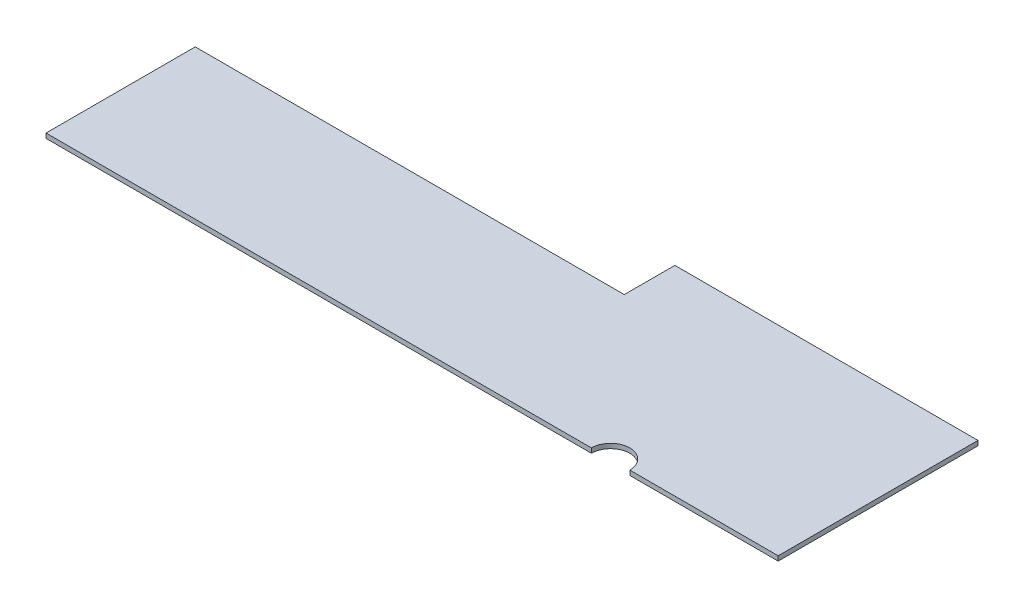
ISO-10303-21;
HEADER;
FILE_DESCRIPTION(('STEP AP214'),'2;1');
FILE_NAME('part.step','',(''),(''),'','','');
FILE_SCHEMA(('AUTOMOTIVE_DESIGN { 1 0 10303 214 1 1 1 1 }'));
ENDSEC;
DATA;
#1=APPLICATION_CONTEXT('core data for automotive mechanical design processes');
#2=APPLICATION_PROTOCOL_DEFINITION('international standard','automotive_design',2000,#1);
#3=PRODUCT_CONTEXT('',#1,'mechanical');
#4=PRODUCT('Part','Part','',(#3));
#5=PRODUCT_RELATED_PRODUCT_CATEGORY('part','',(#4));
#6=PRODUCT_DEFINITION_FORMATION('','',#4);
#7=PRODUCT_DEFINITION_CONTEXT('part definition',#1,'design');
#8=PRODUCT_DEFINITION('design','',#6,#7);
#9=PRODUCT_DEFINITION_SHAPE('','',#8);
#10=(LENGTH_UNIT() NAMED_UNIT(*) SI_UNIT(.MILLI.,.METRE.));
#11=(NAMED_UNIT(*) PLANE_ANGLE_UNIT() SI_UNIT($,.RADIAN.));
#12=(NAMED_UNIT(*) SI_UNIT($,.STERADIAN.) SOLID_ANGLE_UNIT());
#13=UNCERTAINTY_MEASURE_WITH_UNIT(LENGTH_MEASURE(1.E-05),#10,'distance_accuracy_value','');
#14=(GEOMETRIC_REPRESENTATION_CONTEXT(3) GLOBAL_UNCERTAINTY_ASSIGNED_CONTEXT((#13)) GLOBAL_UNIT_ASSIGNED_CONTEXT((#10,
#11,#12)) REPRESENTATION_CONTEXT('',''));
#15=CARTESIAN_POINT('',(0.,0.,0.));
#16=DIRECTION('',(0.,0.,1.));
#17=DIRECTION('',(1.,0.,0.));
#18=AXIS2_PLACEMENT_3D('',#15,#16,#17);
#19=CARTESIAN_POINT('',(906.3228,1.58749999999684,520.7));
#20=DIRECTION('',(0.,-1.,0.));
#21=DIRECTION('',(1.,0.,0.));
#22=AXIS2_PLACEMENT_3D('',#19,#20,#21);
#23=CYLINDRICAL_SURFACE('',#22,13.081);
#24=CARTESIAN_POINT('',(906.3228,-1.58750000000316,520.7));
#25=DIRECTION('',(0.,1.,0.));
#26=DIRECTION('',(-1.,0.,0.));
#27=AXIS2_PLACEMENT_3D('',#24,#25,#26);
#28=CIRCLE('',#27,13.081);
#29=CARTESIAN_POINT('',(919.4038,-1.58750000000321,520.699999999993));
#30=VERTEX_POINT('',#29);
#31=CARTESIAN_POINT('',(893.2418,-1.58750000000312,520.699999999993));
#32=VERTEX_POINT('',#31);
#33=EDGE_CURVE('E127',#30,#32,#28,.T.);
#34=ORIENTED_EDGE('',*,*,#33,.F.);
#35=DIRECTION('',(0.,-1.,0.));
#36=VECTOR('',#35,1.);
#37=CARTESIAN_POINT('',(919.4038,1.58749999999679,520.699999999993));
#38=LINE('',#37,#36);
#39=CARTESIAN_POINT('',(919.4038,1.58749999999679,520.699999999993));
#40=VERTEX_POINT('',#39);
#41=EDGE_CURVE('E11',#40,#30,#38,.T.);
#42=ORIENTED_EDGE('',*,*,#41,.F.);
#43=CARTESIAN_POINT('',(906.3228,1.58749999999684,520.7));
#44=DIRECTION('',(0.,1.,0.));
#45=DIRECTION('',(-1.,0.,0.));
#46=AXIS2_PLACEMENT_3D('',#43,#44,#45);
#47=CIRCLE('',#46,13.081);
#48=CARTESIAN_POINT('',(893.2418,1.58749999999688,520.699999999993));
#49=VERTEX_POINT('',#48);
#50=EDGE_CURVE('E144',#40,#49,#47,.T.);
#51=ORIENTED_EDGE('',*,*,#50,.T.);
#52=DIRECTION('',(0.,-1.,0.));
#53=VECTOR('',#52,1.);
#54=CARTESIAN_POINT('',(893.2418,1.58749999999688,520.699999999993));
#55=LINE('',#54,#53);
#56=EDGE_CURVE('E86',#49,#32,#55,.T.);
#57=ORIENTED_EDGE('',*,*,#56,.T.);
#58=EDGE_LOOP('',(#34,#42,#51,#57));
#59=FACE_BOUND('',#58,.T.);
#60=ADVANCED_FACE('F35',(#59),#23,.F.);
#61=CARTESIAN_POINT('',(0.,1.5875,520.699999999993));
#62=DIRECTION('',(0.,0.,1.));
#63=DIRECTION('',(0.,-1.,0.));
#64=AXIS2_PLACEMENT_3D('',#61,#62,#63);
#65=PLANE('',#64);
#66=DIRECTION('',(-1.,0.,0.));
#67=VECTOR('',#66,1.);
#68=CARTESIAN_POINT('',(0.,-1.5875,520.699999999993));
#69=LINE('',#68,#67);
#70=CARTESIAN_POINT('',(1020.41959999994,-1.58750000000356,520.699999999993));
#71=VERTEX_POINT('',#70);
#72=EDGE_CURVE('E130',#71,#30,#69,.T.);
#73=ORIENTED_EDGE('',*,*,#72,.F.);
#74=DIRECTION('',(0.,-1.,0.));
#75=VECTOR('',#74,1.);
#76=CARTESIAN_POINT('',(1020.41959999994,1.58749999999644,520.699999999993));
#77=LINE('',#76,#75);
#78=CARTESIAN_POINT('',(1020.41959999994,1.58749999999644,520.699999999993));
#79=VERTEX_POINT('',#78);
#80=EDGE_CURVE('E43',#79,#71,#77,.T.);
#81=ORIENTED_EDGE('',*,*,#80,.F.);
#82=DIRECTION('',(-1.,0.,0.));
#83=VECTOR('',#82,1.);
#84=CARTESIAN_POINT('',(0.,1.5875,520.699999999993));
#85=LINE('',#84,#83);
#86=EDGE_CURVE('E177',#79,#40,#85,.T.);
#87=ORIENTED_EDGE('',*,*,#86,.T.);
#88=ORIENTED_EDGE('',*,*,#41,.T.);
#89=EDGE_LOOP('',(#73,#81,#87,#88));
#90=FACE_BOUND('',#89,.T.);
#91=ADVANCED_FACE('F162',(#90),#65,.T.);
#92=CARTESIAN_POINT('',(1020.41959999994,1.58749999999644,0.));
#93=DIRECTION('',(1.,0.,0.));
#94=DIRECTION('',(0.,1.,0.));
#95=AXIS2_PLACEMENT_3D('',#92,#93,#94);
#96=PLANE('',#95);
#97=DIRECTION('',(0.,0.,1.));
#98=VECTOR('',#97,1.);
#99=CARTESIAN_POINT('',(1020.41959999994,-1.58750000000356,0.));
#100=LINE('',#99,#98);
#101=CARTESIAN_POINT('',(1020.41959999994,-1.58750000000356,384.668661408231));
#102=VERTEX_POINT('',#101);
#103=EDGE_CURVE('E133',#102,#71,#100,.T.);
#104=ORIENTED_EDGE('',*,*,#103,.F.);
#105=DIRECTION('',(0.,-1.,0.));
#106=VECTOR('',#105,1.);
#107=CARTESIAN_POINT('',(1020.41959999994,1.58749999999644,384.668661408231));
#108=LINE('',#107,#106);
#109=CARTESIAN_POINT('',(1020.41959999994,1.58749999999644,384.668661408231));
#110=VERTEX_POINT('',#109);
#111=EDGE_CURVE('E151',#110,#102,#108,.T.);
#112=ORIENTED_EDGE('',*,*,#111,.F.);
#113=DIRECTION('',(0.,0.,1.));
#114=VECTOR('',#113,1.);
#115=CARTESIAN_POINT('',(1020.41959999994,1.58749999999644,0.));
#116=LINE('',#115,#114);
#117=EDGE_CURVE('E158',#110,#79,#116,.T.);
#118=ORIENTED_EDGE('',*,*,#117,.T.);
#119=ORIENTED_EDGE('',*,*,#80,.T.);
#120=EDGE_LOOP('',(#104,#112,#118,#119));
#121=FACE_BOUND('',#120,.T.);
#122=ADVANCED_FACE('F156',(#121),#96,.T.);
#123=CARTESIAN_POINT('',(0.,1.5875,384.668661408231));
#124=DIRECTION('',(0.,0.,1.));
#125=DIRECTION('',(0.,-1.,0.));
#126=AXIS2_PLACEMENT_3D('',#123,#124,#125);
#127=PLANE('',#126);
#128=DIRECTION('',(-1.,0.,0.));
#129=VECTOR('',#128,1.);
#130=CARTESIAN_POINT('',(0.,-1.5875,384.668661408231));
#131=LINE('',#130,#129);
#132=CARTESIAN_POINT('',(814.044599999936,-1.58750000000284,384.668661408231));
#133=VERTEX_POINT('',#132);
#134=EDGE_CURVE('E136',#102,#133,#131,.T.);
#135=ORIENTED_EDGE('',*,*,#134,.T.);
#136=DIRECTION('',(0.,-1.,0.));
#137=VECTOR('',#136,1.);
#138=CARTESIAN_POINT('',(814.044599999936,1.58749999999716,384.668661408231));
#139=LINE('',#138,#137);
#140=CARTESIAN_POINT('',(814.044599999936,1.58749999999716,384.668661408231));
#141=VERTEX_POINT('',#140);
#142=EDGE_CURVE('E148',#141,#133,#139,.T.);
#143=ORIENTED_EDGE('',*,*,#142,.F.);
#144=DIRECTION('',(-1.,0.,0.));
#145=VECTOR('',#144,1.);
#146=CARTESIAN_POINT('',(0.,1.5875,384.668661408231));
#147=LINE('',#146,#145);
#148=EDGE_CURVE('E173',#110,#141,#147,.T.);
#149=ORIENTED_EDGE('',*,*,#148,.F.);
#150=ORIENTED_EDGE('',*,*,#111,.T.);
#151=EDGE_LOOP('',(#135,#143,#149,#150));
#152=FACE_BOUND('',#151,.T.);
#153=ADVANCED_FACE('F169',(#152),#127,.F.);
#154=CARTESIAN_POINT('',(814.044599999936,1.58749999999716,0.));
#155=DIRECTION('',(1.,0.,0.));
#156=DIRECTION('',(0.,1.,0.));
#157=AXIS2_PLACEMENT_3D('',#154,#155,#156);
#158=PLANE('',#157);
#159=DIRECTION('',(0.,0.,1.));
#160=VECTOR('',#159,1.);
#161=CARTESIAN_POINT('',(814.044599999936,-1.58750000000284,0.));
#162=LINE('',#161,#160);
#163=CARTESIAN_POINT('',(814.044599999936,-1.58750000000284,419.099999999993));
#164=VERTEX_POINT('',#163);
#165=EDGE_CURVE('E138',#133,#164,#162,.T.);
#166=ORIENTED_EDGE('',*,*,#165,.T.);
#167=DIRECTION('',(0.,-1.,0.));
#168=VECTOR('',#167,1.);
#169=CARTESIAN_POINT('',(814.044599999936,1.58749999999716,419.099999999993));
#170=LINE('',#169,#168);
#171=CARTESIAN_POINT('',(814.044599999936,1.58749999999716,419.099999999993));
#172=VERTEX_POINT('',#171);
#173=EDGE_CURVE('E119',#172,#164,#170,.T.);
#174=ORIENTED_EDGE('',*,*,#173,.F.);
#175=DIRECTION('',(0.,0.,1.));
#176=VECTOR('',#175,1.);
#177=CARTESIAN_POINT('',(814.044599999936,1.58749999999716,0.));
#178=LINE('',#177,#176);
#179=EDGE_CURVE('E110',#141,#172,#178,.T.);
#180=ORIENTED_EDGE('',*,*,#179,.F.);
#181=ORIENTED_EDGE('',*,*,#142,.T.);
#182=EDGE_LOOP('',(#166,#174,#180,#181));
#183=FACE_BOUND('',#182,.T.);
#184=ADVANCED_FACE('F172',(#183),#158,.F.);
#185=CARTESIAN_POINT('',(0.,1.5875,419.099999999993));
#186=DIRECTION('',(0.,0.,1.));
#187=DIRECTION('',(1.,0.,0.));
#188=AXIS2_PLACEMENT_3D('',#185,#186,#187);
#189=PLANE('',#188);
#190=DIRECTION('',(-1.,0.,0.));
#191=VECTOR('',#190,1.);
#192=CARTESIAN_POINT('',(0.,-1.5875,419.099999999993));
#193=LINE('',#192,#191);
#194=CARTESIAN_POINT('',(521.944599999935,-1.58750000000182,419.099999999993));
#195=VERTEX_POINT('',#194);
#196=EDGE_CURVE('E118',#164,#195,#193,.T.);
#197=ORIENTED_EDGE('',*,*,#196,.T.);
#198=DIRECTION('',(0.,-1.,0.));
#199=VECTOR('',#198,1.);
#200=CARTESIAN_POINT('',(521.944599999935,1.58749999999818,419.099999999993));
#201=LINE('',#200,#199);
#202=CARTESIAN_POINT('',(521.944599999935,1.58749999999818,419.099999999993));
#203=VERTEX_POINT('',#202);
#204=EDGE_CURVE('E115',#203,#195,#201,.T.);
#205=ORIENTED_EDGE('',*,*,#204,.F.);
#206=DIRECTION('',(-1.,0.,0.));
#207=VECTOR('',#206,1.);
#208=CARTESIAN_POINT('',(0.,1.5875,419.099999999993));
#209=LINE('',#208,#207);
#210=EDGE_CURVE('E104',#172,#203,#209,.T.);
#211=ORIENTED_EDGE('',*,*,#210,.F.);
#212=ORIENTED_EDGE('',*,*,#173,.T.);
#213=EDGE_LOOP('',(#197,#205,#211,#212));
#214=FACE_BOUND('',#213,.T.);
#215=ADVANCED_FACE('F116',(#214),#189,.F.);
#216=CARTESIAN_POINT('',(521.944599999934,1.58749999999818,-5.70349323325487E-13));
#217=DIRECTION('',(1.,0.,0.));
#218=DIRECTION('',(0.,1.,0.));
#219=AXIS2_PLACEMENT_3D('',#216,#217,#218);
#220=PLANE('',#219);
#221=DIRECTION('',(0.,0.,1.));
#222=VECTOR('',#221,1.);
#223=CARTESIAN_POINT('',(521.944599999934,-1.58750000000182,-5.70349323325487E-13));
#224=LINE('',#223,#222);
#225=CARTESIAN_POINT('',(521.944599999935,-1.58750000000182,520.699999999993));
#226=VERTEX_POINT('',#225);
#227=EDGE_CURVE('E79',#195,#226,#224,.T.);
#228=ORIENTED_EDGE('',*,*,#227,.T.);
#229=DIRECTION('',(0.,-1.,0.));
#230=VECTOR('',#229,1.);
#231=CARTESIAN_POINT('',(521.944599999935,1.58749999999818,520.699999999993));
#232=LINE('',#231,#230);
#233=CARTESIAN_POINT('',(521.944599999935,1.58749999999818,520.699999999993));
#234=VERTEX_POINT('',#233);
#235=EDGE_CURVE('E120',#234,#226,#232,.T.);
#236=ORIENTED_EDGE('',*,*,#235,.F.);
#237=DIRECTION('',(0.,0.,1.));
#238=VECTOR('',#237,1.);
#239=CARTESIAN_POINT('',(521.944599999934,1.58749999999818,-5.70349323325487E-13));
#240=LINE('',#239,#238);
#241=EDGE_CURVE('E108',#203,#234,#240,.T.);
#242=ORIENTED_EDGE('',*,*,#241,.F.);
#243=ORIENTED_EDGE('',*,*,#204,.T.);
#244=EDGE_LOOP('',(#228,#236,#242,#243));
#245=FACE_BOUND('',#244,.T.);
#246=ADVANCED_FACE('F122',(#245),#220,.F.);
#247=CARTESIAN_POINT('',(-1.82021148769077E-11,1.5875,520.699999999975));
#248=DIRECTION('',(0.,0.,-1.));
#249=DIRECTION('',(-1.,0.,0.));
#250=AXIS2_PLACEMENT_3D('',#247,#248,#249);
#251=PLANE('',#250);
#252=DIRECTION('',(1.,0.,0.));
#253=VECTOR('',#252,1.);
#254=CARTESIAN_POINT('',(-1.82132003301585E-11,-1.5875,520.699999999975));
#255=LINE('',#254,#253);
#256=EDGE_CURVE('E142',#226,#32,#255,.T.);
#257=ORIENTED_EDGE('',*,*,#256,.T.);
#258=ORIENTED_EDGE('',*,*,#56,.F.);
#259=DIRECTION('',(1.,0.,0.));
#260=VECTOR('',#259,1.);
#261=CARTESIAN_POINT('',(-1.82021148769077E-11,1.5875,520.699999999975));
#262=LINE('',#261,#260);
#263=EDGE_CURVE('E51',#234,#49,#262,.T.);
#264=ORIENTED_EDGE('',*,*,#263,.F.);
#265=ORIENTED_EDGE('',*,*,#235,.T.);
#266=EDGE_LOOP('',(#257,#258,#264,#265));
#267=FACE_BOUND('',#266,.T.);
#268=ADVANCED_FACE('F196',(#267),#251,.F.);
#269=CARTESIAN_POINT('',(0.,1.5875,0.));
#270=DIRECTION('',(0.,1.,0.));
#271=DIRECTION('',(-1.,0.,0.));
#272=AXIS2_PLACEMENT_3D('',#269,#270,#271);
#273=PLANE('',#272);
#274=ORIENTED_EDGE('',*,*,#50,.F.);
#275=ORIENTED_EDGE('',*,*,#86,.F.);
#276=ORIENTED_EDGE('',*,*,#117,.F.);
#277=ORIENTED_EDGE('',*,*,#148,.T.);
#278=ORIENTED_EDGE('',*,*,#179,.T.);
#279=ORIENTED_EDGE('',*,*,#210,.T.);
#280=ORIENTED_EDGE('',*,*,#241,.T.);
#281=ORIENTED_EDGE('',*,*,#263,.T.);
#282=EDGE_LOOP('',(#274,#275,#276,#277,#278,#279,#280,#281));
#283=FACE_BOUND('',#282,.T.);
#284=ADVANCED_FACE('F106',(#283),#273,.T.);
#285=CARTESIAN_POINT('',(0.,-1.5875,0.));
#286=DIRECTION('',(0.,1.,0.));
#287=DIRECTION('',(-1.,0.,0.));
#288=AXIS2_PLACEMENT_3D('',#285,#286,#287);
#289=PLANE('',#288);
#290=ORIENTED_EDGE('',*,*,#33,.T.);
#291=ORIENTED_EDGE('',*,*,#256,.F.);
#292=ORIENTED_EDGE('',*,*,#227,.F.);
#293=ORIENTED_EDGE('',*,*,#196,.F.);
#294=ORIENTED_EDGE('',*,*,#165,.F.);
#295=ORIENTED_EDGE('',*,*,#134,.F.);
#296=ORIENTED_EDGE('',*,*,#103,.T.);
#297=ORIENTED_EDGE('',*,*,#72,.T.);
#298=EDGE_LOOP('',(#290,#291,#292,#293,#294,#295,#296,#297));
#299=FACE_BOUND('',#298,.T.);
#300=ADVANCED_FACE('F165',(#299),#289,.F.);
#301=CLOSED_SHELL('',(#60,#91,#122,#153,#184,#215,#246,#268,#284,#300));
#302=MANIFOLD_SOLID_BREP('B2',#301);
#303=ADVANCED_BREP_SHAPE_REPRESENTATION('',(#18,#302),#14);
#304=SHAPE_DEFINITION_REPRESENTATION(#9,#303);
ENDSEC;
END-ISO-10303-21;
